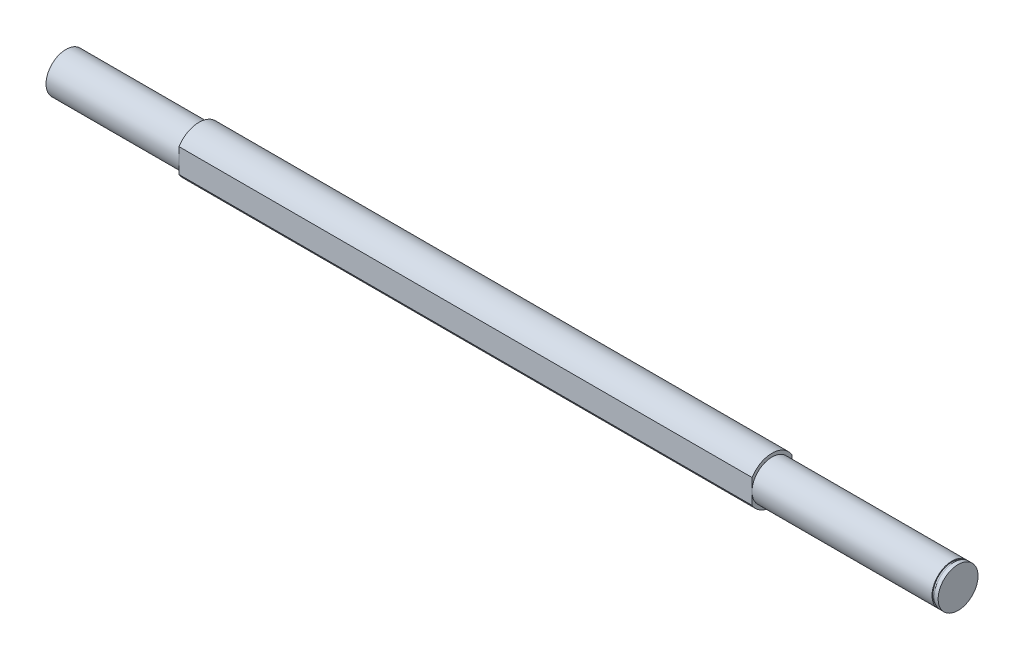
ISO-10303-21;
HEADER;
FILE_DESCRIPTION(('STEP AP214'),'2;1');
FILE_NAME('part.step','',(''),(''),'','','');
FILE_SCHEMA(('AUTOMOTIVE_DESIGN { 1 0 10303 214 1 1 1 1 }'));
ENDSEC;
DATA;
#1=APPLICATION_CONTEXT('core data for automotive mechanical design processes');
#2=APPLICATION_PROTOCOL_DEFINITION('international standard','automotive_design',2000,#1);
#3=PRODUCT_CONTEXT('',#1,'mechanical');
#4=PRODUCT('Part','Part','',(#3));
#5=PRODUCT_RELATED_PRODUCT_CATEGORY('part','',(#4));
#6=PRODUCT_DEFINITION_FORMATION('','',#4);
#7=PRODUCT_DEFINITION_CONTEXT('part definition',#1,'design');
#8=PRODUCT_DEFINITION('design','',#6,#7);
#9=PRODUCT_DEFINITION_SHAPE('','',#8);
#10=(LENGTH_UNIT() NAMED_UNIT(*) SI_UNIT(.MILLI.,.METRE.));
#11=(NAMED_UNIT(*) PLANE_ANGLE_UNIT() SI_UNIT($,.RADIAN.));
#12=(NAMED_UNIT(*) SI_UNIT($,.STERADIAN.) SOLID_ANGLE_UNIT());
#13=UNCERTAINTY_MEASURE_WITH_UNIT(LENGTH_MEASURE(1.E-05),#10,'distance_accuracy_value','');
#14=(GEOMETRIC_REPRESENTATION_CONTEXT(3) GLOBAL_UNCERTAINTY_ASSIGNED_CONTEXT((#13)) GLOBAL_UNIT_ASSIGNED_CONTEXT((#10,
#11,#12)) REPRESENTATION_CONTEXT('',''));
#15=CARTESIAN_POINT('',(0.,0.,0.));
#16=DIRECTION('',(0.,0.,1.));
#17=DIRECTION('',(1.,0.,0.));
#18=AXIS2_PLACEMENT_3D('',#15,#16,#17);
#19=CARTESIAN_POINT('',(-335.5,0.,0.));
#20=DIRECTION('',(-1.,0.,0.));
#21=DIRECTION('',(0.,0.,1.));
#22=AXIS2_PLACEMENT_3D('',#19,#20,#21);
#23=CYLINDRICAL_SURFACE('',#22,15.);
#24=CARTESIAN_POINT('',(330.9,0.,0.));
#25=DIRECTION('',(1.,0.,0.));
#26=DIRECTION('',(0.,0.,-1.));
#27=AXIS2_PLACEMENT_3D('',#24,#25,#26);
#28=CIRCLE('',#27,15.);
#29=CARTESIAN_POINT('',(330.9,0.,-15.));
#30=VERTEX_POINT('',#29);
#31=EDGE_CURVE('E139',#30,#30,#28,.T.);
#32=ORIENTED_EDGE('',*,*,#31,.F.);
#33=EDGE_LOOP('',(#32));
#34=FACE_BOUND('',#33,.T.);
#35=CARTESIAN_POINT('',(195.5,0.,0.));
#36=DIRECTION('',(-1.,0.,0.));
#37=DIRECTION('',(0.,0.,1.));
#38=AXIS2_PLACEMENT_3D('',#35,#36,#37);
#39=CIRCLE('',#38,15.);
#40=CARTESIAN_POINT('',(195.5,0.104892540191238,14.9996332473502));
#41=VERTEX_POINT('',#40);
#42=CARTESIAN_POINT('',(195.5,0.104892540191238,-14.9996332473502));
#43=VERTEX_POINT('',#42);
#44=EDGE_CURVE('E205',#41,#43,#39,.T.);
#45=ORIENTED_EDGE('',*,*,#44,.F.);
#46=EDGE_CURVE('E204',#43,#41,#39,.T.);
#47=ORIENTED_EDGE('',*,*,#46,.F.);
#48=EDGE_LOOP('',(#45,#47));
#49=FACE_BOUND('',#48,.T.);
#50=CARTESIAN_POINT('',(292.5,-3.67913522676102,-14.5418005756924));
#51=CARTESIAN_POINT('',(292.363588172093,-3.67915648136962,-14.5417800982577));
#52=CARTESIAN_POINT('',(292.227185014359,-3.67339592184694,-14.5432522212717));
#53=CARTESIAN_POINT('',(291.955436759906,-3.65046960052938,-14.5490318734438));
#54=CARTESIAN_POINT('',(291.820091387546,-3.63330691748687,-14.5533386372014));
#55=CARTESIAN_POINT('',(291.551821342899,-3.58780189753442,-14.564621244706));
#56=CARTESIAN_POINT('',(291.418890703097,-3.55949271981301,-14.5715891700573));
#57=CARTESIAN_POINT('',(291.155975354342,-3.49198425115428,-14.5879148131006));
#58=CARTESIAN_POINT('',(291.025990752042,-3.45278456663786,-14.5972726171611));
#59=CARTESIAN_POINT('',(290.76994100167,-3.36389199675928,-14.61801311888));
#60=CARTESIAN_POINT('',(290.643872780107,-3.31420759112256,-14.6293941790252));
#61=CARTESIAN_POINT('',(290.39633145206,-3.20476476927196,-14.6537579628432));
#62=CARTESIAN_POINT('',(290.274860080898,-3.14500259422136,-14.6667412836457));
#63=CARTESIAN_POINT('',(289.918431071587,-2.95126097984972,-14.7073961656618));
#64=CARTESIAN_POINT('',(289.691349816361,-2.80278841330839,-14.7367821167116));
#65=CARTESIAN_POINT('',(289.256362129662,-2.46579052380941,-14.7969630839034));
#66=CARTESIAN_POINT('',(289.049415751017,-2.27603616575332,-14.8277712183835));
#67=CARTESIAN_POINT('',(288.668979759463,-1.86485618253093,-14.8850713011021));
#68=CARTESIAN_POINT('',(288.495496104131,-1.64342492992798,-14.911562480636));
#69=CARTESIAN_POINT('',(288.182599665868,-1.1684264356469,-14.9563722483617));
#70=CARTESIAN_POINT('',(288.044194343739,-0.914171270457918,-14.9744594787211));
#71=CARTESIAN_POINT('',(287.812039475588,-0.385474172146854,-14.9973759978278));
#72=CARTESIAN_POINT('',(287.718276288112,-0.111038435303165,-15.002209338764));
#73=CARTESIAN_POINT('',(287.581321179188,0.439891343040899,-14.9959898042053));
#74=CARTESIAN_POINT('',(287.536483572902,0.715981712308435,-14.9854836882326));
#75=CARTESIAN_POINT('',(287.493418571686,1.27070957906165,-14.9486616603414));
#76=CARTESIAN_POINT('',(287.495180070612,1.5493464538035,-14.922349516995));
#77=CARTESIAN_POINT('',(287.544221351198,2.08968521134063,-14.856125257603));
#78=CARTESIAN_POINT('',(287.589712996873,2.35162266144199,-14.8167870744522));
#79=CARTESIAN_POINT('',(287.721966186305,2.86275208470373,-14.7265759030039));
#80=CARTESIAN_POINT('',(287.80873001845,3.11194335028764,-14.6757022751915));
#81=CARTESIAN_POINT('',(288.022106131279,3.59454890290142,-14.5650735985027));
#82=CARTESIAN_POINT('',(288.149227537906,3.82771255920701,-14.5052105315841));
#83=CARTESIAN_POINT('',(288.43930244539,4.26938722882429,-14.3814122388427));
#84=CARTESIAN_POINT('',(288.60226569333,4.47789151232806,-14.3174759086741));
#85=CARTESIAN_POINT('',(288.96834474013,4.87497110526447,-14.1873317009893));
#86=CARTESIAN_POINT('',(289.172987637847,5.06214930259414,-14.121158283273));
#87=CARTESIAN_POINT('',(289.612247541708,5.40044191879458,-13.9952814821823));
#88=CARTESIAN_POINT('',(289.846874193754,5.55154468697927,-13.9355801923933));
#89=CARTESIAN_POINT('',(290.218391187969,5.74899527761648,-13.8547538878176));
#90=CARTESIAN_POINT('',(290.346569255958,5.81030471496535,-13.829101465471));
#91=CARTESIAN_POINT('',(290.608206226196,5.92213262960228,-13.7815833133688));
#92=CARTESIAN_POINT('',(290.741662902594,5.97265559895493,-13.759716008008));
#93=CARTESIAN_POINT('',(291.012771358208,6.06244446130048,-13.7203925531159));
#94=CARTESIAN_POINT('',(291.15041839138,6.10172260130231,-13.7029316069913));
#95=CARTESIAN_POINT('',(291.428960193059,6.16873430793418,-13.6728950882717));
#96=CARTESIAN_POINT('',(291.569853447452,6.19647314615956,-13.6603172850456));
#97=CARTESIAN_POINT('',(291.842053058188,6.23834661084547,-13.641244151714));
#98=CARTESIAN_POINT('',(291.973186899473,6.25341773456079,-13.63433131702));
#99=CARTESIAN_POINT('',(292.236210415874,6.27351723634423,-13.6250872478885));
#100=CARTESIAN_POINT('',(292.368098894585,6.27855857336707,-13.6227501015094));
#101=CARTESIAN_POINT('',(292.5,6.27854442161653,-13.6227706413119));
#102=B_SPLINE_CURVE_WITH_KNOTS('',3,(#50,#51,#52,#53,#54,#55,#56,#57,#58,#59,#60,#61,#62,#63,
#64,#65,#66,#67,#68,#69,#70,#71,#72,#73,#74,#75,#76,#77,#78,#79,#80,#81,#82,#83,#84,#85,#86,#87,
#88,#89,#90,#91,#92,#93,#94,#95,#96,#97,#98,#99,#100,#101),.UNSPECIFIED.,.F.,.F.,(4,2,2,2,2,2,2,
2,2,2,2,2,2,2,2,2,2,2,2,2,2,2,2,2,2,4),(0.,0.409092423677147,0.818074430847326,1.22584885885817,
1.6336380256108,2.04109864022582,2.44871156823775,3.26359482908315,4.10724851154048,
4.95105225659396,5.81687991006166,6.68244281946293,7.51789679977672,8.35315166493871,
9.15564418669335,9.958181208819,10.771274204705,11.584588592845,12.4361259663091,
13.2879379758687,13.7206337000479,14.1531488734623,14.5851911765746,15.0170358888757,
15.4131122811712,15.8086765909865),.UNSPECIFIED.);
#103=CARTESIAN_POINT('',(292.5,-3.67913522676102,-14.5418005756923));
#104=VERTEX_POINT('',#103);
#105=CARTESIAN_POINT('',(292.5,6.27854442161653,-13.6227706413119));
#106=VERTEX_POINT('',#105);
#107=EDGE_CURVE('E225',#104,#106,#102,.T.);
#108=ORIENTED_EDGE('',*,*,#107,.F.);
#109=DIRECTION('',(-1.,0.,0.));
#110=VECTOR('',#109,1.);
#111=CARTESIAN_POINT('',(-335.5,-3.67913522676108,-14.5418005756924));
#112=LINE('',#111,#110);
#113=CARTESIAN_POINT('',(322.5,-3.67913522676102,-14.5418005756924));
#114=VERTEX_POINT('',#113);
#115=EDGE_CURVE('E11',#114,#104,#112,.T.);
#116=ORIENTED_EDGE('',*,*,#115,.F.);
#117=CARTESIAN_POINT('',(322.5,6.27854442161654,-13.6227706413119));
#118=CARTESIAN_POINT('',(322.636411827907,6.27856156923924,-13.6227466195976));
#119=CARTESIAN_POINT('',(322.772814985641,6.2731677588318,-13.62524821938));
#120=CARTESIAN_POINT('',(323.044563240094,6.25168655511325,-13.6351264011555));
#121=CARTESIAN_POINT('',(323.179908612454,6.23560204845747,-13.6425016671793));
#122=CARTESIAN_POINT('',(323.448178657101,6.19293074824879,-13.6619223832185));
#123=CARTESIAN_POINT('',(323.581109296903,6.16637510445978,-13.6739539795346));
#124=CARTESIAN_POINT('',(323.844024645658,6.10299506213124,-13.7023597922472));
#125=CARTESIAN_POINT('',(323.974009247958,6.06617029246894,-13.718734165589));
#126=CARTESIAN_POINT('',(324.23005899833,5.98257541926461,-13.7553941514746));
#127=CARTESIAN_POINT('',(324.356127219893,5.93581335249481,-13.775676602138));
#128=CARTESIAN_POINT('',(324.60366854794,5.83267853124638,-13.8196599383304));
#129=CARTESIAN_POINT('',(324.725139919102,5.77630219071803,-13.8433620988748));
#130=CARTESIAN_POINT('',(325.081568928413,5.59327430813129,-13.9187903877781));
#131=CARTESIAN_POINT('',(325.308650183639,5.45268824293882,-13.9748545956845));
#132=CARTESIAN_POINT('',(325.743637870338,5.13239783865763,-14.0956990546567));
#133=CARTESIAN_POINT('',(325.950584248983,4.95148762674984,-14.1607171504371));
#134=CARTESIAN_POINT('',(326.331020240537,4.55774095359051,-14.2923067984277));
#135=CARTESIAN_POINT('',(326.504503895868,4.34489881926824,-14.3588786248976));
#136=CARTESIAN_POINT('',(326.817400334132,3.88612559899696,-14.4898695299821));
#137=CARTESIAN_POINT('',(326.955805656261,3.63947586517388,-14.5541870682772));
#138=CARTESIAN_POINT('',(327.187960524411,3.12390405490463,-14.6734829067051));
#139=CARTESIAN_POINT('',(327.281723711887,2.85498881173182,-14.7284640564825));
#140=CARTESIAN_POINT('',(327.418678820812,2.31222716604763,-14.8231852222828));
#141=CARTESIAN_POINT('',(327.463516427098,2.03887768917224,-14.8633888784234));
#142=CARTESIAN_POINT('',(327.506581428314,1.48678099698291,-14.9287196549701));
#143=CARTESIAN_POINT('',(327.504819929388,1.20803508364784,-14.9538503663087));
#144=CARTESIAN_POINT('',(327.455778648801,0.664703000267779,-14.9876419717553));
#145=CARTESIAN_POINT('',(327.410287003127,0.399990288050093,-14.9969102191393));
#146=CARTESIAN_POINT('',(327.278033813695,-0.119016153749792,-15.0017739777854));
#147=CARTESIAN_POINT('',(327.19126998155,-0.373309304757359,-14.9973687308288));
#148=CARTESIAN_POINT('',(326.97789386872,-0.868010687737559,-14.976939213041));
#149=CARTESIAN_POINT('',(326.850772462093,-1.10819229305891,-14.9607628763741));
#150=CARTESIAN_POINT('',(326.56069755461,-1.56506462061399,-14.9198947056098));
#151=CARTESIAN_POINT('',(326.397734306669,-1.78174892884821,-14.8952005540776));
#152=CARTESIAN_POINT('',(326.03165525987,-2.19594097488662,-14.8399315128431));
#153=CARTESIAN_POINT('',(325.827012362153,-2.39206889394094,-14.8091347900424));
#154=CARTESIAN_POINT('',(325.387752458291,-2.74768595631173,-14.7473013995536));
#155=CARTESIAN_POINT('',(325.153125806246,-2.90716326256424,-14.7162646576823));
#156=CARTESIAN_POINT('',(324.781608812031,-3.11607194060588,-14.6729427060499));
#157=CARTESIAN_POINT('',(324.653430744041,-3.18104083376335,-14.6589449632971));
#158=CARTESIAN_POINT('',(324.391793773804,-3.2996768731711,-14.6326971552953));
#159=CARTESIAN_POINT('',(324.258337097405,-3.35334872398462,-14.6204463632308));
#160=CARTESIAN_POINT('',(323.987228641792,-3.44881814186285,-14.5982210588245));
#161=CARTESIAN_POINT('',(323.84958160862,-3.49062862696751,-14.5882440724619));
#162=CARTESIAN_POINT('',(323.571039806941,-3.56200587773666,-14.5709799664861));
#163=CARTESIAN_POINT('',(323.430146552548,-3.59157823421522,-14.5636916187725));
#164=CARTESIAN_POINT('',(323.157946941812,-3.63623527853092,-14.5526046961664));
#165=CARTESIAN_POINT('',(323.026813100527,-3.65231705908838,-14.5485670746326));
#166=CARTESIAN_POINT('',(322.763789584125,-3.67376895818169,-14.543157933172));
#167=CARTESIAN_POINT('',(322.631901105415,-3.67915289881695,-14.541782973023));
#168=CARTESIAN_POINT('',(322.5,-3.67913522676102,-14.5418005756924));
#169=B_SPLINE_CURVE_WITH_KNOTS('',3,(#117,#118,#119,#120,#121,#122,#123,#124,#125,#126,#127,
#128,#129,#130,#131,#132,#133,#134,#135,#136,#137,#138,#139,#140,#141,#142,#143,#144,#145,#146,
#147,#148,#149,#150,#151,#152,#153,#154,#155,#156,#157,#158,#159,#160,#161,#162,#163,#164,#165,
#166,#167,#168),.UNSPECIFIED.,.F.,.F.,(4,2,2,2,2,2,2,2,2,2,2,2,2,2,2,2,2,2,2,2,2,2,2,2,2,4),(0.,
0.409092423677147,0.818074430847326,1.22584885885823,1.63363802561081,2.04109864022582,
2.44871156823775,3.26359482908315,4.10724851154048,4.95105225659396,5.81687991006164,
6.68244281946293,7.51789679977673,8.35315166493871,9.15564418669336,9.958181208819,
10.771274204705,11.584588592845,12.4361259663091,13.2879379758687,13.7206337000479,
14.1531488734624,14.5851911765747,15.0170358888757,15.4131122811712,15.8086765909865),.UNSPECIFIED.);
#170=CARTESIAN_POINT('',(322.5,6.27854442161654,-13.6227706413119));
#171=VERTEX_POINT('',#170);
#172=EDGE_CURVE('E47',#171,#114,#169,.T.);
#173=ORIENTED_EDGE('',*,*,#172,.F.);
#174=DIRECTION('',(-1.,0.,0.));
#175=VECTOR('',#174,1.);
#176=CARTESIAN_POINT('',(-335.5,6.27854442161645,-13.6227706413119));
#177=LINE('',#176,#175);
#178=EDGE_CURVE('E137',#106,#171,#177,.F.);
#179=ORIENTED_EDGE('',*,*,#178,.F.);
#180=EDGE_LOOP('',(#108,#116,#173,#179));
#181=FACE_BOUND('',#180,.T.);
#182=ADVANCED_FACE('F38',(#34,#49,#181),#23,.T.);
#183=CARTESIAN_POINT('',(195.5,17.5,0.));
#184=DIRECTION('',(-1.,0.,0.));
#185=DIRECTION('',(0.,0.,1.));
#186=AXIS2_PLACEMENT_3D('',#183,#184,#185);
#187=PLANE('',#186);
#188=CARTESIAN_POINT('',(195.5,0.,0.));
#189=DIRECTION('',(-1.,0.,0.));
#190=DIRECTION('',(0.,0.,1.));
#191=AXIS2_PLACEMENT_3D('',#188,#189,#190);
#192=CIRCLE('',#191,17.5);
#193=CARTESIAN_POINT('',(195.5,-8.90876525755466,-15.0626658193624));
#194=VERTEX_POINT('',#193);
#195=CARTESIAN_POINT('',(195.5,-8.90876525755465,15.0626658193624));
#196=VERTEX_POINT('',#195);
#197=EDGE_CURVE('E199',#194,#196,#192,.T.);
#198=ORIENTED_EDGE('',*,*,#197,.F.);
#199=DIRECTION('',(0.,-0.999975549823344,-0.0069928360127505));
#200=VECTOR('',#199,1.);
#201=CARTESIAN_POINT('',(195.5,9.11855033793717,-14.9366006753379));
#202=LINE('',#201,#200);
#203=EDGE_CURVE('E171',#43,#194,#202,.T.);
#204=ORIENTED_EDGE('',*,*,#203,.F.);
#205=ORIENTED_EDGE('',*,*,#46,.T.);
#206=DIRECTION('',(0.,0.999975549823344,-0.0069928360127505));
#207=VECTOR('',#206,1.);
#208=CARTESIAN_POINT('',(195.5,9.11855033793717,14.9366006753379));
#209=LINE('',#208,#207);
#210=EDGE_CURVE('E166',#196,#41,#209,.T.);
#211=ORIENTED_EDGE('',*,*,#210,.F.);
#212=EDGE_LOOP('',(#198,#204,#205,#211));
#213=FACE_BOUND('',#212,.T.);
#214=ADVANCED_FACE('F289',(#213),#187,.F.);
#215=CARTESIAN_POINT('',(-335.5,0.,0.));
#216=DIRECTION('',(-1.,0.,0.));
#217=DIRECTION('',(0.,0.,1.));
#218=AXIS2_PLACEMENT_3D('',#215,#216,#217);
#219=CYLINDRICAL_SURFACE('',#218,17.5);
#220=CARTESIAN_POINT('',(195.5,9.11855033793717,14.9366006753379));
#221=VERTEX_POINT('',#220);
#222=CARTESIAN_POINT('',(195.5,9.11855033793717,-14.9366006753379));
#223=VERTEX_POINT('',#222);
#224=EDGE_CURVE('E200',#221,#223,#192,.T.);
#225=ORIENTED_EDGE('',*,*,#224,.T.);
#226=DIRECTION('',(-1.,0.,0.));
#227=VECTOR('',#226,1.);
#228=CARTESIAN_POINT('',(213.708655185849,9.11855033793717,-14.9366006753379));
#229=LINE('',#228,#227);
#230=CARTESIAN_POINT('',(-235.5,9.11855033793717,-14.9366006753379));
#231=VERTEX_POINT('',#230);
#232=EDGE_CURVE('E167',#223,#231,#229,.T.);
#233=ORIENTED_EDGE('',*,*,#232,.T.);
#234=CARTESIAN_POINT('',(-235.5,0.,0.));
#235=DIRECTION('',(-1.,0.,0.));
#236=DIRECTION('',(0.,0.,1.));
#237=AXIS2_PLACEMENT_3D('',#234,#235,#236);
#238=CIRCLE('',#237,17.5);
#239=CARTESIAN_POINT('',(-235.5,9.11855033793716,14.9366006753379));
#240=VERTEX_POINT('',#239);
#241=EDGE_CURVE('E195',#240,#231,#238,.T.);
#242=ORIENTED_EDGE('',*,*,#241,.F.);
#243=DIRECTION('',(-1.,0.,0.));
#244=VECTOR('',#243,1.);
#245=CARTESIAN_POINT('',(213.708655185849,9.11855033793717,14.9366006753379));
#246=LINE('',#245,#244);
#247=EDGE_CURVE('E180',#221,#240,#246,.T.);
#248=ORIENTED_EDGE('',*,*,#247,.F.);
#249=EDGE_LOOP('',(#225,#233,#242,#248));
#250=FACE_BOUND('',#249,.T.);
#251=ADVANCED_FACE('F280',(#250),#219,.T.);
#252=CARTESIAN_POINT('',(-235.5,15.,0.));
#253=DIRECTION('',(1.,0.,0.));
#254=DIRECTION('',(0.,0.,-1.));
#255=AXIS2_PLACEMENT_3D('',#252,#253,#254);
#256=PLANE('',#255);
#257=ORIENTED_EDGE('',*,*,#241,.T.);
#258=DIRECTION('',(0.,-0.999975549823344,-0.0069928360127505));
#259=VECTOR('',#258,1.);
#260=CARTESIAN_POINT('',(-235.5,15.1041590438587,-14.8947432718));
#261=LINE('',#260,#259);
#262=CARTESIAN_POINT('',(-235.5,0.104892540191236,-14.9996332473502));
#263=VERTEX_POINT('',#262);
#264=EDGE_CURVE('E221',#231,#263,#261,.T.);
#265=ORIENTED_EDGE('',*,*,#264,.T.);
#266=CARTESIAN_POINT('',(-235.5,0.,0.));
#267=DIRECTION('',(-1.,0.,0.));
#268=DIRECTION('',(0.,0.,1.));
#269=AXIS2_PLACEMENT_3D('',#266,#267,#268);
#270=CIRCLE('',#269,15.);
#271=CARTESIAN_POINT('',(-235.5,0.104892540191236,14.9996332473502));
#272=VERTEX_POINT('',#271);
#273=EDGE_CURVE('E190',#272,#263,#270,.T.);
#274=ORIENTED_EDGE('',*,*,#273,.F.);
#275=DIRECTION('',(0.,-0.999975549823344,0.0069928360127505));
#276=VECTOR('',#275,1.);
#277=CARTESIAN_POINT('',(-235.5,9.11855033793717,14.9366006753379));
#278=LINE('',#277,#276);
#279=EDGE_CURVE('E162',#240,#272,#278,.T.);
#280=ORIENTED_EDGE('',*,*,#279,.F.);
#281=EDGE_LOOP('',(#257,#265,#274,#280));
#282=FACE_BOUND('',#281,.T.);
#283=ADVANCED_FACE('F405',(#282),#256,.F.);
#284=CARTESIAN_POINT('',(-335.5,0.,0.));
#285=DIRECTION('',(-1.,0.,0.));
#286=DIRECTION('',(0.,0.,1.));
#287=AXIS2_PLACEMENT_3D('',#284,#285,#286);
#288=CYLINDRICAL_SURFACE('',#287,15.);
#289=CARTESIAN_POINT('',(-335.5,0.,0.));
#290=DIRECTION('',(-1.,0.,0.));
#291=DIRECTION('',(0.,0.,1.));
#292=AXIS2_PLACEMENT_3D('',#289,#290,#291);
#293=CIRCLE('',#292,15.);
#294=CARTESIAN_POINT('',(-335.5,0.,15.));
#295=VERTEX_POINT('',#294);
#296=EDGE_CURVE('E213',#295,#295,#293,.T.);
#297=ORIENTED_EDGE('',*,*,#296,.F.);
#298=EDGE_LOOP('',(#297));
#299=FACE_BOUND('',#298,.T.);
#300=ORIENTED_EDGE('',*,*,#273,.T.);
#301=EDGE_CURVE('E177',#263,#272,#270,.T.);
#302=ORIENTED_EDGE('',*,*,#301,.T.);
#303=EDGE_LOOP('',(#300,#302));
#304=FACE_BOUND('',#303,.T.);
#305=ADVANCED_FACE('F40',(#299,#304),#288,.T.);
#306=CARTESIAN_POINT('',(-335.5,0.,0.));
#307=DIRECTION('',(1.,0.,0.));
#308=DIRECTION('',(0.,0.,-1.));
#309=AXIS2_PLACEMENT_3D('',#306,#307,#308);
#310=PLANE('',#309);
#311=ORIENTED_EDGE('',*,*,#296,.T.);
#312=EDGE_LOOP('',(#311));
#313=FACE_BOUND('',#312,.T.);
#314=ADVANCED_FACE('F422',(#313),#310,.F.);
#315=ORIENTED_EDGE('',*,*,#44,.T.);
#316=EDGE_CURVE('E174',#223,#43,#202,.T.);
#317=ORIENTED_EDGE('',*,*,#316,.F.);
#318=ORIENTED_EDGE('',*,*,#224,.F.);
#319=EDGE_CURVE('E185',#41,#221,#209,.T.);
#320=ORIENTED_EDGE('',*,*,#319,.F.);
#321=EDGE_LOOP('',(#315,#317,#318,#320));
#322=FACE_BOUND('',#321,.T.);
#323=ADVANCED_FACE('F282',(#322),#187,.F.);
#324=CARTESIAN_POINT('',(-235.5,-8.90876525755469,-15.0626658193624));
#325=VERTEX_POINT('',#324);
#326=CARTESIAN_POINT('',(-235.5,-8.90876525755465,15.0626658193624));
#327=VERTEX_POINT('',#326);
#328=EDGE_CURVE('E194',#325,#327,#238,.T.);
#329=ORIENTED_EDGE('',*,*,#328,.F.);
#330=DIRECTION('',(-1.,0.,0.));
#331=VECTOR('',#330,1.);
#332=CARTESIAN_POINT('',(213.708655185849,-8.90876525755465,-15.0626658193624));
#333=LINE('',#332,#331);
#334=EDGE_CURVE('E61',#194,#325,#333,.T.);
#335=ORIENTED_EDGE('',*,*,#334,.F.);
#336=ORIENTED_EDGE('',*,*,#197,.T.);
#337=DIRECTION('',(-1.,0.,0.));
#338=VECTOR('',#337,1.);
#339=CARTESIAN_POINT('',(213.708655185849,-8.90876525755465,15.0626658193624));
#340=LINE('',#339,#338);
#341=EDGE_CURVE('E181',#196,#327,#340,.T.);
#342=ORIENTED_EDGE('',*,*,#341,.T.);
#343=EDGE_LOOP('',(#329,#335,#336,#342));
#344=FACE_BOUND('',#343,.T.);
#345=ADVANCED_FACE('F402',(#344),#219,.T.);
#346=ORIENTED_EDGE('',*,*,#301,.F.);
#347=DIRECTION('',(0.,0.999975549823344,0.0069928360127505));
#348=VECTOR('',#347,1.);
#349=CARTESIAN_POINT('',(-235.5,9.11855033793717,-14.9366006753379));
#350=LINE('',#349,#348);
#351=EDGE_CURVE('E163',#325,#263,#350,.T.);
#352=ORIENTED_EDGE('',*,*,#351,.F.);
#353=ORIENTED_EDGE('',*,*,#328,.T.);
#354=DIRECTION('',(0.,0.999975549823344,-0.0069928360127505));
#355=VECTOR('',#354,1.);
#356=CARTESIAN_POINT('',(-235.5,15.1041590438587,14.8947432718));
#357=LINE('',#356,#355);
#358=EDGE_CURVE('E217',#327,#272,#357,.T.);
#359=ORIENTED_EDGE('',*,*,#358,.T.);
#360=EDGE_LOOP('',(#346,#352,#353,#359));
#361=FACE_BOUND('',#360,.T.);
#362=ADVANCED_FACE('F392',(#361),#256,.F.);
#363=CARTESIAN_POINT('',(213.708655185849,9.11855033793717,14.9366006753379));
#364=DIRECTION('',(0.,-0.0069928360127505,-0.999975549823344));
#365=DIRECTION('',(0.,0.999975549823344,-0.0069928360127505));
#366=AXIS2_PLACEMENT_3D('',#363,#364,#365);
#367=PLANE('',#366);
#368=ORIENTED_EDGE('',*,*,#210,.T.);
#369=ORIENTED_EDGE('',*,*,#319,.T.);
#370=ORIENTED_EDGE('',*,*,#247,.T.);
#371=ORIENTED_EDGE('',*,*,#279,.T.);
#372=ORIENTED_EDGE('',*,*,#358,.F.);
#373=ORIENTED_EDGE('',*,*,#341,.F.);
#374=EDGE_LOOP('',(#368,#369,#370,#371,#372,#373));
#375=FACE_BOUND('',#374,.T.);
#376=ADVANCED_FACE('F273',(#375),#367,.F.);
#377=CARTESIAN_POINT('',(213.708655185849,9.11855033793717,-14.9366006753379));
#378=DIRECTION('',(0.,-0.0069928360127505,0.999975549823344));
#379=DIRECTION('',(0.,-0.999975549823344,-0.0069928360127505));
#380=AXIS2_PLACEMENT_3D('',#377,#378,#379);
#381=PLANE('',#380);
#382=ORIENTED_EDGE('',*,*,#316,.T.);
#383=ORIENTED_EDGE('',*,*,#203,.T.);
#384=ORIENTED_EDGE('',*,*,#334,.T.);
#385=ORIENTED_EDGE('',*,*,#351,.T.);
#386=ORIENTED_EDGE('',*,*,#264,.F.);
#387=ORIENTED_EDGE('',*,*,#232,.F.);
#388=EDGE_LOOP('',(#382,#383,#384,#385,#386,#387));
#389=FACE_BOUND('',#388,.T.);
#390=ADVANCED_FACE('F285',(#389),#381,.F.);
#391=CARTESIAN_POINT('',(330.9,0.,-15.));
#392=DIRECTION('',(-1.,0.,0.));
#393=DIRECTION('',(0.,0.,1.));
#394=AXIS2_PLACEMENT_3D('',#391,#392,#393);
#395=PLANE('',#394);
#396=CARTESIAN_POINT('',(330.9,0.,0.));
#397=DIRECTION('',(1.,0.,0.));
#398=DIRECTION('',(0.,0.,-1.));
#399=AXIS2_PLACEMENT_3D('',#396,#397,#398);
#400=CIRCLE('',#399,14.3);
#401=CARTESIAN_POINT('',(330.9,0.,-14.3));
#402=VERTEX_POINT('',#401);
#403=EDGE_CURVE('E158',#402,#402,#400,.T.);
#404=ORIENTED_EDGE('',*,*,#403,.F.);
#405=EDGE_LOOP('',(#404));
#406=FACE_BOUND('',#405,.T.);
#407=ORIENTED_EDGE('',*,*,#31,.T.);
#408=EDGE_LOOP('',(#407));
#409=FACE_BOUND('',#408,.T.);
#410=ADVANCED_FACE('F366',(#406,#409),#395,.F.);
#411=CARTESIAN_POINT('',(335.5,0.,0.));
#412=DIRECTION('',(1.,0.,0.));
#413=DIRECTION('',(0.,0.,-1.));
#414=AXIS2_PLACEMENT_3D('',#411,#412,#413);
#415=CYLINDRICAL_SURFACE('',#414,14.3);
#416=CARTESIAN_POINT('',(332.5,0.,0.));
#417=DIRECTION('',(1.,0.,0.));
#418=DIRECTION('',(0.,0.,-1.));
#419=AXIS2_PLACEMENT_3D('',#416,#417,#418);
#420=CIRCLE('',#419,14.3);
#421=CARTESIAN_POINT('',(332.5,0.,-14.3));
#422=VERTEX_POINT('',#421);
#423=EDGE_CURVE('E154',#422,#422,#420,.T.);
#424=ORIENTED_EDGE('',*,*,#423,.F.);
#425=EDGE_LOOP('',(#424));
#426=FACE_BOUND('',#425,.T.);
#427=ORIENTED_EDGE('',*,*,#403,.T.);
#428=EDGE_LOOP('',(#427));
#429=FACE_BOUND('',#428,.T.);
#430=ADVANCED_FACE('F357',(#426,#429),#415,.T.);
#431=CARTESIAN_POINT('',(332.5,0.,-15.));
#432=DIRECTION('',(1.,0.,0.));
#433=DIRECTION('',(0.,0.,-1.));
#434=AXIS2_PLACEMENT_3D('',#431,#432,#433);
#435=PLANE('',#434);
#436=CARTESIAN_POINT('',(332.5,0.,0.));
#437=DIRECTION('',(1.,0.,0.));
#438=DIRECTION('',(0.,0.,-1.));
#439=AXIS2_PLACEMENT_3D('',#436,#437,#438);
#440=CIRCLE('',#439,15.);
#441=CARTESIAN_POINT('',(332.5,0.,-15.));
#442=VERTEX_POINT('',#441);
#443=EDGE_CURVE('E145',#442,#442,#440,.T.);
#444=ORIENTED_EDGE('',*,*,#443,.F.);
#445=EDGE_LOOP('',(#444));
#446=FACE_BOUND('',#445,.T.);
#447=ORIENTED_EDGE('',*,*,#423,.T.);
#448=EDGE_LOOP('',(#447));
#449=FACE_BOUND('',#448,.T.);
#450=ADVANCED_FACE('F251',(#446,#449),#435,.F.);
#451=CARTESIAN_POINT('',(335.5,15.,0.));
#452=DIRECTION('',(-1.,0.,0.));
#453=DIRECTION('',(0.,0.,1.));
#454=AXIS2_PLACEMENT_3D('',#451,#452,#453);
#455=PLANE('',#454);
#456=CARTESIAN_POINT('',(335.5,0.,0.));
#457=DIRECTION('',(-1.,0.,0.));
#458=DIRECTION('',(0.,0.,1.));
#459=AXIS2_PLACEMENT_3D('',#456,#457,#458);
#460=CIRCLE('',#459,15.);
#461=CARTESIAN_POINT('',(335.5,0.,15.));
#462=VERTEX_POINT('',#461);
#463=EDGE_CURVE('E209',#462,#462,#460,.T.);
#464=ORIENTED_EDGE('',*,*,#463,.F.);
#465=EDGE_LOOP('',(#464));
#466=FACE_BOUND('',#465,.T.);
#467=ADVANCED_FACE('F345',(#466),#455,.F.);
#468=ORIENTED_EDGE('',*,*,#443,.T.);
#469=EDGE_LOOP('',(#468));
#470=FACE_BOUND('',#469,.T.);
#471=ORIENTED_EDGE('',*,*,#463,.T.);
#472=EDGE_LOOP('',(#471));
#473=FACE_BOUND('',#472,.T.);
#474=ADVANCED_FACE('F234',(#470,#473),#23,.T.);
#475=CARTESIAN_POINT('',(322.5,0.919029934380498,-9.95767964837755));
#476=DIRECTION('',(0.,0.0919029934380498,-0.995767964837756));
#477=DIRECTION('',(0.,0.995767964837756,0.0919029934380498));
#478=AXIS2_PLACEMENT_3D('',#475,#476,#477);
#479=CYLINDRICAL_SURFACE('',#478,5.);
#480=DIRECTION('',(0.,0.0919029934380498,-0.995767964837756));
#481=VECTOR('',#480,1.);
#482=CARTESIAN_POINT('',(322.5,5.89786975856928,-9.4981646811873));
#483=LINE('',#482,#481);
#484=CARTESIAN_POINT('',(322.5,5.89786975856928,-9.4981646811873));
#485=VERTEX_POINT('',#484);
#486=EDGE_CURVE('E131',#485,#171,#483,.T.);
#487=ORIENTED_EDGE('',*,*,#486,.T.);
#488=ORIENTED_EDGE('',*,*,#172,.T.);
#489=DIRECTION('',(0.,0.0919029934380498,-0.995767964837756));
#490=VECTOR('',#489,1.);
#491=CARTESIAN_POINT('',(322.5,-4.05980988980828,-10.4171946155678));
#492=LINE('',#491,#490);
#493=CARTESIAN_POINT('',(322.5,-4.05980988980828,-10.4171946155678));
#494=VERTEX_POINT('',#493);
#495=EDGE_CURVE('E53',#494,#114,#492,.T.);
#496=ORIENTED_EDGE('',*,*,#495,.F.);
#497=CARTESIAN_POINT('',(322.5,0.919029934380498,-9.95767964837755));
#498=DIRECTION('',(0.,-0.0919029934380498,0.995767964837756));
#499=DIRECTION('',(0.,-0.995767964837756,-0.0919029934380498));
#500=AXIS2_PLACEMENT_3D('',#497,#498,#499);
#501=CIRCLE('',#500,5.);
#502=EDGE_CURVE('E120',#494,#485,#501,.T.);
#503=ORIENTED_EDGE('',*,*,#502,.T.);
#504=EDGE_LOOP('',(#487,#488,#496,#503));
#505=FACE_BOUND('',#504,.T.);
#506=ADVANCED_FACE('F130',(#505),#479,.F.);
#507=CARTESIAN_POINT('',(322.5,5.89786975856928,-9.4981646811873));
#508=DIRECTION('',(0.,-0.995767964837756,-0.0919029934380498));
#509=DIRECTION('',(0.,0.0919029934380498,-0.995767964837756));
#510=AXIS2_PLACEMENT_3D('',#507,#508,#509);
#511=PLANE('',#510);
#512=ORIENTED_EDGE('',*,*,#178,.T.);
#513=ORIENTED_EDGE('',*,*,#486,.F.);
#514=DIRECTION('',(-1.,0.,0.));
#515=VECTOR('',#514,1.);
#516=CARTESIAN_POINT('',(322.5,5.89786975856928,-9.4981646811873));
#517=LINE('',#516,#515);
#518=CARTESIAN_POINT('',(292.5,5.89786975856927,-9.4981646811873));
#519=VERTEX_POINT('',#518);
#520=EDGE_CURVE('E116',#485,#519,#517,.T.);
#521=ORIENTED_EDGE('',*,*,#520,.T.);
#522=DIRECTION('',(0.,0.0919029934380498,-0.995767964837756));
#523=VECTOR('',#522,1.);
#524=CARTESIAN_POINT('',(292.5,5.89786975856927,-9.4981646811873));
#525=LINE('',#524,#523);
#526=EDGE_CURVE('E140',#519,#106,#525,.T.);
#527=ORIENTED_EDGE('',*,*,#526,.T.);
#528=EDGE_LOOP('',(#512,#513,#521,#527));
#529=FACE_BOUND('',#528,.T.);
#530=ADVANCED_FACE('F135',(#529),#511,.T.);
#531=CARTESIAN_POINT('',(292.5,0.919029934380495,-9.95767964837755));
#532=DIRECTION('',(0.,0.0919029934380498,-0.995767964837756));
#533=DIRECTION('',(0.,0.995767964837756,0.0919029934380498));
#534=AXIS2_PLACEMENT_3D('',#531,#532,#533);
#535=CYLINDRICAL_SURFACE('',#534,5.);
#536=DIRECTION('',(0.,0.0919029934380498,-0.995767964837756));
#537=VECTOR('',#536,1.);
#538=CARTESIAN_POINT('',(292.5,-4.05980988980828,-10.4171946155678));
#539=LINE('',#538,#537);
#540=CARTESIAN_POINT('',(292.5,-4.05980988980828,-10.4171946155678));
#541=VERTEX_POINT('',#540);
#542=EDGE_CURVE('E147',#541,#104,#539,.T.);
#543=ORIENTED_EDGE('',*,*,#542,.T.);
#544=ORIENTED_EDGE('',*,*,#107,.T.);
#545=ORIENTED_EDGE('',*,*,#526,.F.);
#546=CARTESIAN_POINT('',(292.5,0.919029934380495,-9.95767964837755));
#547=DIRECTION('',(0.,-0.0919029934380498,0.995767964837756));
#548=DIRECTION('',(0.,-0.995767964837756,-0.0919029934380498));
#549=AXIS2_PLACEMENT_3D('',#546,#547,#548);
#550=CIRCLE('',#549,5.);
#551=EDGE_CURVE('E121',#519,#541,#550,.T.);
#552=ORIENTED_EDGE('',*,*,#551,.T.);
#553=EDGE_LOOP('',(#543,#544,#545,#552));
#554=FACE_BOUND('',#553,.T.);
#555=ADVANCED_FACE('F238',(#554),#535,.F.);
#556=CARTESIAN_POINT('',(322.5,-4.05980988980828,-10.4171946155678));
#557=DIRECTION('',(0.,0.995767964837756,0.0919029934380498));
#558=DIRECTION('',(0.,-0.0919029934380498,0.995767964837756));
#559=AXIS2_PLACEMENT_3D('',#556,#557,#558);
#560=PLANE('',#559);
#561=ORIENTED_EDGE('',*,*,#115,.T.);
#562=ORIENTED_EDGE('',*,*,#542,.F.);
#563=DIRECTION('',(1.,0.,0.));
#564=VECTOR('',#563,1.);
#565=CARTESIAN_POINT('',(322.5,-4.05980988980828,-10.4171946155678));
#566=LINE('',#565,#564);
#567=EDGE_CURVE('E298',#541,#494,#566,.T.);
#568=ORIENTED_EDGE('',*,*,#567,.T.);
#569=ORIENTED_EDGE('',*,*,#495,.T.);
#570=EDGE_LOOP('',(#561,#562,#568,#569));
#571=FACE_BOUND('',#570,.T.);
#572=ADVANCED_FACE('F243',(#571),#560,.T.);
#573=CARTESIAN_POINT('',(322.5,0.919029934380498,-9.95767964837755));
#574=DIRECTION('',(0.,-0.0919029934380498,0.995767964837756));
#575=DIRECTION('',(0.,-0.995767964837756,-0.0919029934380498));
#576=AXIS2_PLACEMENT_3D('',#573,#574,#575);
#577=PLANE('',#576);
#578=ORIENTED_EDGE('',*,*,#502,.F.);
#579=ORIENTED_EDGE('',*,*,#567,.F.);
#580=ORIENTED_EDGE('',*,*,#551,.F.);
#581=ORIENTED_EDGE('',*,*,#520,.F.);
#582=EDGE_LOOP('',(#578,#579,#580,#581));
#583=FACE_BOUND('',#582,.T.);
#584=ADVANCED_FACE('F118',(#583),#577,.F.);
#585=CLOSED_SHELL('',(#182,#214,#251,#283,#305,#314,#323,#345,#362,#376,#390,#410,#430,#450,
#467,#474,#506,#530,#555,#572,#584));
#586=MANIFOLD_SOLID_BREP('B2',#585);
#587=ADVANCED_BREP_SHAPE_REPRESENTATION('',(#18,#586),#14);
#588=SHAPE_DEFINITION_REPRESENTATION(#9,#587);
ENDSEC;
END-ISO-10303-21;
